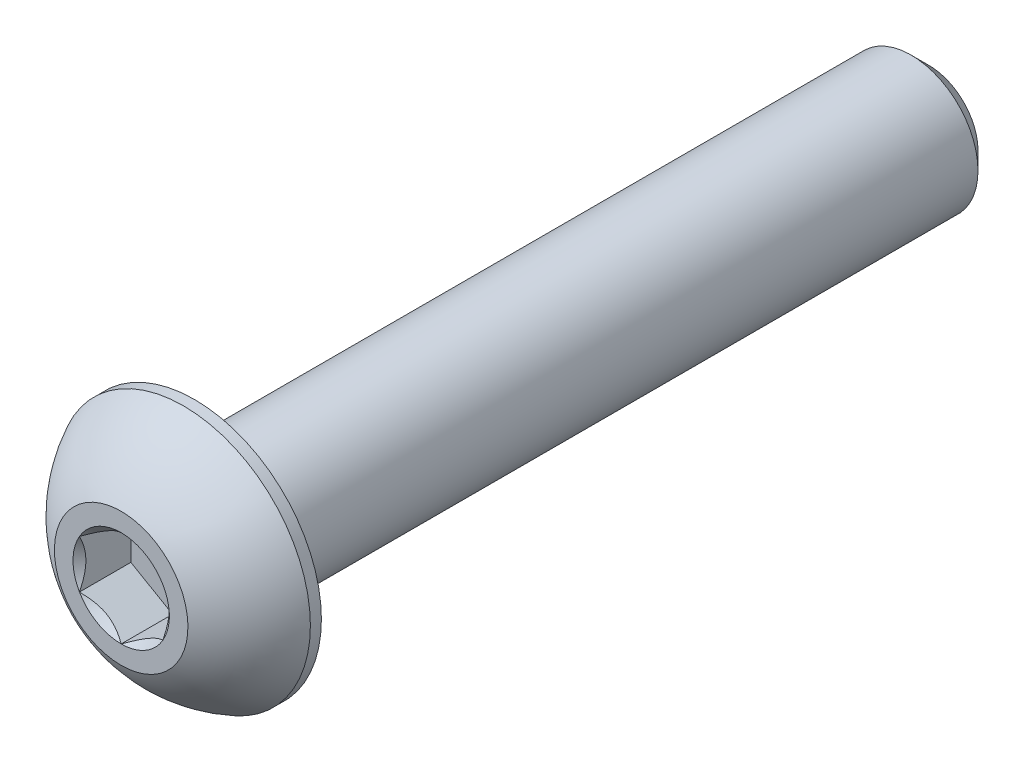
ISO-10303-21;
HEADER;
FILE_DESCRIPTION(('STEP AP214'),'2;1');
FILE_NAME('part.step','',(''),(''),'','','');
FILE_SCHEMA(('AUTOMOTIVE_DESIGN { 1 0 10303 214 1 1 1 1 }'));
ENDSEC;
DATA;
#1=APPLICATION_CONTEXT('core data for automotive mechanical design processes');
#2=APPLICATION_PROTOCOL_DEFINITION('international standard','automotive_design',2000,#1);
#3=PRODUCT_CONTEXT('',#1,'mechanical');
#4=PRODUCT('Part','Part','',(#3));
#5=PRODUCT_RELATED_PRODUCT_CATEGORY('part','',(#4));
#6=PRODUCT_DEFINITION_FORMATION('','',#4);
#7=PRODUCT_DEFINITION_CONTEXT('part definition',#1,'design');
#8=PRODUCT_DEFINITION('design','',#6,#7);
#9=PRODUCT_DEFINITION_SHAPE('','',#8);
#10=(LENGTH_UNIT() NAMED_UNIT(*) SI_UNIT(.MILLI.,.METRE.));
#11=(NAMED_UNIT(*) PLANE_ANGLE_UNIT() SI_UNIT($,.RADIAN.));
#12=(NAMED_UNIT(*) SI_UNIT($,.STERADIAN.) SOLID_ANGLE_UNIT());
#13=UNCERTAINTY_MEASURE_WITH_UNIT(LENGTH_MEASURE(1.E-05),#10,'distance_accuracy_value','');
#14=(GEOMETRIC_REPRESENTATION_CONTEXT(3) GLOBAL_UNCERTAINTY_ASSIGNED_CONTEXT((#13)) GLOBAL_UNIT_ASSIGNED_CONTEXT((#10,
#11,#12)) REPRESENTATION_CONTEXT('',''));
#15=CARTESIAN_POINT('',(0.,0.,0.));
#16=DIRECTION('',(0.,0.,1.));
#17=DIRECTION('',(1.,0.,0.));
#18=AXIS2_PLACEMENT_3D('',#15,#16,#17);
#19=CARTESIAN_POINT('',(0.,0.,-24.2));
#20=DIRECTION('',(0.,0.,1.));
#21=DIRECTION('',(1.,0.,0.));
#22=AXIS2_PLACEMENT_3D('',#19,#20,#21);
#23=PLANE('',#22);
#24=CARTESIAN_POINT('',(0.,0.,-24.2));
#25=DIRECTION('',(0.,0.,1.));
#26=DIRECTION('',(1.,0.,0.));
#27=AXIS2_PLACEMENT_3D('',#24,#25,#26);
#28=CIRCLE('',#27,1.47500000000003);
#29=CARTESIAN_POINT('',(1.47500000000003,0.,-24.2));
#30=VERTEX_POINT('',#29);
#31=EDGE_CURVE('E47',#30,#30,#28,.T.);
#32=ORIENTED_EDGE('',*,*,#31,.F.);
#33=EDGE_LOOP('',(#32));
#34=FACE_BOUND('',#33,.T.);
#35=ADVANCED_FACE('F34',(#34),#23,.F.);
#36=CARTESIAN_POINT('',(0.,0.,-24.2));
#37=DIRECTION('',(0.,0.,1.));
#38=DIRECTION('',(1.,0.,0.));
#39=AXIS2_PLACEMENT_3D('',#36,#37,#38);
#40=CONICAL_SURFACE('',#39,1.47500000000003,0.785398163397436);
#41=CARTESIAN_POINT('',(0.,0.,-23.675));
#42=DIRECTION('',(0.,0.,1.));
#43=DIRECTION('',(1.,0.,0.));
#44=AXIS2_PLACEMENT_3D('',#41,#42,#43);
#45=CIRCLE('',#44,2.00000000000001);
#46=CARTESIAN_POINT('',(2.00000000000001,0.,-23.675));
#47=VERTEX_POINT('',#46);
#48=EDGE_CURVE('E173',#47,#47,#45,.T.);
#49=ORIENTED_EDGE('',*,*,#48,.F.);
#50=EDGE_LOOP('',(#49));
#51=FACE_BOUND('',#50,.T.);
#52=ORIENTED_EDGE('',*,*,#31,.T.);
#53=EDGE_LOOP('',(#52));
#54=FACE_BOUND('',#53,.T.);
#55=ADVANCED_FACE('F178',(#51,#54),#40,.T.);
#56=CARTESIAN_POINT('',(0.,0.,0.));
#57=DIRECTION('',(0.,0.,1.));
#58=DIRECTION('',(1.,0.,0.));
#59=AXIS2_PLACEMENT_3D('',#56,#57,#58);
#60=CYLINDRICAL_SURFACE('',#59,2.00000000000001);
#61=CARTESIAN_POINT('',(0.,0.,-2.2));
#62=DIRECTION('',(0.,0.,1.));
#63=DIRECTION('',(1.,0.,0.));
#64=AXIS2_PLACEMENT_3D('',#61,#62,#63);
#65=CIRCLE('',#64,2.00000000000001);
#66=CARTESIAN_POINT('',(2.00000000000001,0.,-2.2));
#67=VERTEX_POINT('',#66);
#68=EDGE_CURVE('E170',#67,#67,#65,.T.);
#69=ORIENTED_EDGE('',*,*,#68,.F.);
#70=EDGE_LOOP('',(#69));
#71=FACE_BOUND('',#70,.T.);
#72=ORIENTED_EDGE('',*,*,#48,.T.);
#73=EDGE_LOOP('',(#72));
#74=FACE_BOUND('',#73,.T.);
#75=ADVANCED_FACE('F184',(#71,#74),#60,.T.);
#76=CARTESIAN_POINT('',(0.,-3.8,-2.2));
#77=DIRECTION('',(0.,0.,1.));
#78=DIRECTION('',(1.,0.,0.));
#79=AXIS2_PLACEMENT_3D('',#76,#77,#78);
#80=PLANE('',#79);
#81=CARTESIAN_POINT('',(0.,0.,-2.2));
#82=DIRECTION('',(0.,0.,1.));
#83=DIRECTION('',(1.,0.,0.));
#84=AXIS2_PLACEMENT_3D('',#81,#82,#83);
#85=CIRCLE('',#84,3.8);
#86=CARTESIAN_POINT('',(3.8,0.,-2.2));
#87=VERTEX_POINT('',#86);
#88=EDGE_CURVE('E164',#87,#87,#85,.T.);
#89=ORIENTED_EDGE('',*,*,#88,.F.);
#90=EDGE_LOOP('',(#89));
#91=FACE_BOUND('',#90,.T.);
#92=ORIENTED_EDGE('',*,*,#68,.T.);
#93=EDGE_LOOP('',(#92));
#94=FACE_BOUND('',#93,.T.);
#95=ADVANCED_FACE('F189',(#91,#94),#80,.F.);
#96=CARTESIAN_POINT('',(0.,0.,-3.72644385026738));
#97=DIRECTION('',(0.,0.,1.));
#98=DIRECTION('',(0.,-1.,0.));
#99=AXIS2_PLACEMENT_3D('',#96,#97,#98);
#100=SPHERICAL_SURFACE('',#99,4.22922968981299);
#101=CARTESIAN_POINT('',(0.,0.,0.));
#102=DIRECTION('',(0.,0.,1.));
#103=DIRECTION('',(1.,0.,0.));
#104=AXIS2_PLACEMENT_3D('',#101,#102,#103);
#105=CIRCLE('',#104,2.00000000000001);
#106=CARTESIAN_POINT('',(0.,-2.00000000000001,0.));
#107=VERTEX_POINT('',#106);
#108=EDGE_CURVE('E167',#107,#107,#105,.T.);
#109=CARTESIAN_POINT('',(0.,0.,-1.87));
#110=DIRECTION('',(0.,0.,1.));
#111=DIRECTION('',(1.,0.,0.));
#112=AXIS2_PLACEMENT_3D('',#109,#110,#111);
#113=CIRCLE('',#112,3.8);
#114=CARTESIAN_POINT('',(0.,-3.8,-1.87));
#115=VERTEX_POINT('',#114);
#116=EDGE_CURVE('E161',#115,#115,#113,.T.);
#117=CARTESIAN_POINT('',(0.,-2.00000000000001,0.));
#118=CARTESIAN_POINT('',(0.,-2.02421343985615,-0.0129954259644869));
#119=CARTESIAN_POINT('',(0.,-2.04830018323976,-0.0262269129651298));
#120=CARTESIAN_POINT('',(0.,-2.09621120342127,-0.0531568415057489));
#121=CARTESIAN_POINT('',(0.,-2.12003548021918,-0.0668552830457251));
#122=CARTESIAN_POINT('',(0.,-2.16741249358868,-0.0947139531320313));
#123=CARTESIAN_POINT('',(0.,-2.19096523016027,-0.108874181678362));
#124=CARTESIAN_POINT('',(0.,-2.23779021933684,-0.137651035235957));
#125=CARTESIAN_POINT('',(0.,-2.26106247194182,-0.152267660247222));
#126=CARTESIAN_POINT('',(0.,-2.30731764886073,-0.181951755514141));
#127=CARTESIAN_POINT('',(0.,-2.33030057317466,-0.197019225769796));
#128=CARTESIAN_POINT('',(0.,-2.37596836104236,-0.227599285582871));
#129=CARTESIAN_POINT('',(0.,-2.39865322459613,-0.243111875140292));
#130=CARTESIAN_POINT('',(0.,-2.44371627121514,-0.274576279395883));
#131=CARTESIAN_POINT('',(0.,-2.46609445428039,-0.290528094094054));
#132=CARTESIAN_POINT('',(0.,-2.51053563686182,-0.322864887331673));
#133=CARTESIAN_POINT('',(0.,-2.53259863637801,-0.339249865871121));
#134=CARTESIAN_POINT('',(0.,-2.57640106852493,-0.372446760967232));
#135=CARTESIAN_POINT('',(0.,-2.59814050115565,-0.389258677523893));
#136=CARTESIAN_POINT('',(0.,-2.64128753915154,-0.423303060588149));
#137=CARTESIAN_POINT('',(0.,-2.66269514451672,-0.440535527095743));
#138=CARTESIAN_POINT('',(0.,-2.70517039368396,-0.475414462202968));
#139=CARTESIAN_POINT('',(0.,-2.72623803748603,-0.493060930802598));
#140=CARTESIAN_POINT('',(0.,-2.76802535840619,-0.52876116492441));
#141=CARTESIAN_POINT('',(0.,-2.78874503552429,-0.546814930446591));
#142=CARTESIAN_POINT('',(0.,-2.82982855017314,-0.583322898482808));
#143=CARTESIAN_POINT('',(0.,-2.8501923877039,-0.601777100996845));
#144=CARTESIAN_POINT('',(0.,-2.89055648548395,-0.639078930931024));
#145=CARTESIAN_POINT('',(0.,-2.91055674573325,-0.657926558351167));
#146=CARTESIAN_POINT('',(0.,-2.95018608940553,-0.696008076521268));
#147=CARTESIAN_POINT('',(0.,-2.96981517282853,-0.715241967271226));
#148=CARTESIAN_POINT('',(0.,-3.00869470434028,-0.754088703755296));
#149=CARTESIAN_POINT('',(0.,-3.02794515242904,-0.773701549489407));
#150=CARTESIAN_POINT('',(0.,-3.06606009863533,-0.813298743603727));
#151=CARTESIAN_POINT('',(0.,-3.08492459675287,-0.833283091983936));
#152=CARTESIAN_POINT('',(0.,-3.12226047503003,-0.873615697891679));
#153=CARTESIAN_POINT('',(0.,-3.14073185518965,-0.893963955419214));
#154=CARTESIAN_POINT('',(0.,-3.17727447893822,-0.935016647847444));
#155=CARTESIAN_POINT('',(0.,-3.19534572252716,-0.95572108274814));
#156=CARTESIAN_POINT('',(0.,-3.23108120656243,-0.99747826281099));
#157=CARTESIAN_POINT('',(0.,-3.24874544700875,-1.01853100797314));
#158=CARTESIAN_POINT('',(0.,-3.28366021283673,-1.06097680909897));
#159=CARTESIAN_POINT('',(0.,-3.30091073821839,-1.08236986506264));
#160=CARTESIAN_POINT('',(0.,-3.33499151919534,-1.12548815902284));
#161=CARTESIAN_POINT('',(0.,-3.35182177479064,-1.14721339701936));
#162=CARTESIAN_POINT('',(0.,-3.38505562116372,-1.1909878000568));
#163=CARTESIAN_POINT('',(0.,-3.40145921194149,-1.21303696509771));
#164=CARTESIAN_POINT('',(0.,-3.43383349577047,-1.25745084415152));
#165=CARTESIAN_POINT('',(0.,-3.44980418882167,-1.27981555816441));
#166=CARTESIAN_POINT('',(0.,-3.48130660877275,-1.32485203719233));
#167=CARTESIAN_POINT('',(0.,-3.49683833567264,-1.34752380220736));
#168=CARTESIAN_POINT('',(0.,-3.52745692170932,-1.39316576858967));
#169=CARTESIAN_POINT('',(0.,-3.5425437808461,-1.41613596995695));
#170=CARTESIAN_POINT('',(0.,-3.57226689871518,-1.46236608103065));
#171=CARTESIAN_POINT('',(0.,-3.58690315744748,-1.48562599073709));
#172=CARTESIAN_POINT('',(0.,-3.615719513332,-1.5324266802666));
#173=CARTESIAN_POINT('',(0.,-3.62989961048422,-1.55596746008967));
#174=CARTESIAN_POINT('',(0.,-3.65779825442823,-1.6033209453859));
#175=CARTESIAN_POINT('',(0.,-3.67151680122002,-1.62713365085906));
#176=CARTESIAN_POINT('',(0.,-3.69848713452322,-1.67502193787766));
#177=CARTESIAN_POINT('',(0.,-3.71173892103461,-1.6990975194231));
#178=CARTESIAN_POINT('',(0.,-3.73777068821038,-1.74750241579215));
#179=CARTESIAN_POINT('',(0.,-3.75055066887474,-1.77183173061575));
#180=CARTESIAN_POINT('',(0.,-3.77563400658953,-1.82073482944519));
#181=CARTESIAN_POINT('',(0.,-3.78793736363997,-1.84530861345103));
#182=CARTESIAN_POINT('',(0.,-3.8,-1.87));
#183=B_SPLINE_CURVE_WITH_KNOTS('',3,(#117,#118,#119,#120,#121,#122,#123,#124,#125,#126,#127,
#128,#129,#130,#131,#132,#133,#134,#135,#136,#137,#138,#139,#140,#141,#142,#143,#144,#145,#146,
#147,#148,#149,#150,#151,#152,#153,#154,#155,#156,#157,#158,#159,#160,#161,#162,#163,#164,#165,
#166,#167,#168,#169,#170,#171,#172,#173,#174,#175,#176,#177,#178,#179,#180,#181,#182),
.UNSPECIFIED.,.F.,.F.,(4,2,2,2,2,2,2,2,2,2,2,2,2,2,2,2,2,2,2,2,2,2,2,2,2,2,2,2,2,2,2,2,4),(0.,
0.0824398589102638,0.164879717820528,0.247319576730792,0.329759435641056,0.41219929455132,
0.494639153461583,0.577079012371847,0.659518871282112,0.741958730192376,0.82439858910264,
0.906838448012904,0.989278306923168,1.07171816583343,1.1541580247437,1.23659788365396,
1.31903774256422,1.40147760147449,1.48391746038475,1.56635731929502,1.64879717820528,
1.73123703711554,1.81367689602581,1.89611675493607,1.97855661384634,2.0609964727566,
2.14343633166686,2.22587619057713,2.30831604948739,2.39075590839766,2.47319576730792,
2.55563562621818,2.63807548512845),.UNSPECIFIED.);
#184=EDGE_CURVE('BSEAM194',#107,#115,#183,.T.);
#185=ORIENTED_EDGE('',*,*,#108,.F.);
#186=ORIENTED_EDGE('',*,*,#116,.T.);
#187=ORIENTED_EDGE('',*,*,#184,.T.);
#188=ORIENTED_EDGE('',*,*,#184,.F.);
#189=EDGE_LOOP('',(#185,#187,#186,#188));
#190=FACE_BOUND('',#189,.T.);
#191=ADVANCED_FACE('F194',(#190),#100,.T.);
#192=CARTESIAN_POINT('',(0.,-2.00000000000001,0.));
#193=DIRECTION('',(0.,0.,-1.));
#194=DIRECTION('',(-1.,0.,0.));
#195=AXIS2_PLACEMENT_3D('',#192,#193,#194);
#196=PLANE('',#195);
#197=CARTESIAN_POINT('',(0.,0.,0.));
#198=DIRECTION('',(0.,0.,1.));
#199=DIRECTION('',(1.,0.,0.));
#200=AXIS2_PLACEMENT_3D('',#197,#198,#199);
#201=CIRCLE('',#200,1.44337567297406);
#202=CARTESIAN_POINT('',(-1.25,0.721687836487031,0.));
#203=VERTEX_POINT('',#202);
#204=CARTESIAN_POINT('',(-1.25,-0.721687836487033,0.));
#205=VERTEX_POINT('',#204);
#206=EDGE_CURVE('E60',#203,#205,#201,.T.);
#207=ORIENTED_EDGE('',*,*,#206,.F.);
#208=CARTESIAN_POINT('',(0.,1.44337567297406,0.));
#209=VERTEX_POINT('',#208);
#210=EDGE_CURVE('E132',#209,#203,#201,.T.);
#211=ORIENTED_EDGE('',*,*,#210,.F.);
#212=CARTESIAN_POINT('',(1.25,0.721687836487029,0.));
#213=VERTEX_POINT('',#212);
#214=EDGE_CURVE('E129',#213,#209,#201,.T.);
#215=ORIENTED_EDGE('',*,*,#214,.F.);
#216=CARTESIAN_POINT('',(1.25,-0.721687836487029,0.));
#217=VERTEX_POINT('',#216);
#218=EDGE_CURVE('E100',#217,#213,#201,.T.);
#219=ORIENTED_EDGE('',*,*,#218,.F.);
#220=CARTESIAN_POINT('',(0.,-1.44337567297406,0.));
#221=VERTEX_POINT('',#220);
#222=EDGE_CURVE('E92',#221,#217,#201,.T.);
#223=ORIENTED_EDGE('',*,*,#222,.F.);
#224=EDGE_CURVE('E53',#205,#221,#201,.T.);
#225=ORIENTED_EDGE('',*,*,#224,.F.);
#226=EDGE_LOOP('',(#207,#211,#215,#219,#223,#225));
#227=FACE_BOUND('',#226,.T.);
#228=ORIENTED_EDGE('',*,*,#108,.T.);
#229=EDGE_LOOP('',(#228));
#230=FACE_BOUND('',#229,.T.);
#231=ADVANCED_FACE('F126',(#227,#230),#196,.F.);
#232=CARTESIAN_POINT('',(0.,0.,0.));
#233=DIRECTION('',(0.,0.,1.));
#234=DIRECTION('',(1.,0.,0.));
#235=AXIS2_PLACEMENT_3D('',#232,#233,#234);
#236=CYLINDRICAL_SURFACE('',#235,3.8);
#237=ORIENTED_EDGE('',*,*,#116,.F.);
#238=EDGE_LOOP('',(#237));
#239=FACE_BOUND('',#238,.T.);
#240=ORIENTED_EDGE('',*,*,#88,.T.);
#241=EDGE_LOOP('',(#240));
#242=FACE_BOUND('',#241,.T.);
#243=ADVANCED_FACE('F200',(#239,#242),#236,.T.);
#244=CARTESIAN_POINT('',(0.,0.,0.));
#245=DIRECTION('',(0.,0.,1.));
#246=DIRECTION('',(1.,0.,0.));
#247=AXIS2_PLACEMENT_3D('',#244,#245,#246);
#248=CONICAL_SURFACE('',#247,1.44337567297406,0.78539816339745);
#249=ORIENTED_EDGE('',*,*,#218,.T.);
#250=CARTESIAN_POINT('',(1.25,-1.43934010808076,0.462982096892323));
#251=CARTESIAN_POINT('',(1.25,-1.40429313005658,0.436524922632886));
#252=CARTESIAN_POINT('',(1.25,-1.36905087135598,0.410327160354276));
#253=CARTESIAN_POINT('',(1.25,-1.2980965070631,0.358557571839581));
#254=CARTESIAN_POINT('',(1.25,-1.26238428576495,0.332985904356291));
#255=CARTESIAN_POINT('',(1.25,-1.15390111792707,0.257005993689462));
#256=CARTESIAN_POINT('',(1.25,-1.08031646726264,0.207740286189565));
#257=CARTESIAN_POINT('',(1.25,-0.926012322755091,0.111025830263131));
#258=CARTESIAN_POINT('',(1.25,-0.845125318656143,0.0638412989417957));
#259=CARTESIAN_POINT('',(1.25,-0.679311174076599,-0.0224692656095865));
#260=CARTESIAN_POINT('',(1.25,-0.594398891026685,-0.0616224653730992));
#261=CARTESIAN_POINT('',(1.25,-0.466944812460738,-0.109522776311707));
#262=CARTESIAN_POINT('',(1.25,-0.426289985812819,-0.123270510213663));
#263=CARTESIAN_POINT('',(1.25,-0.343998850091265,-0.147502072549456));
#264=CARTESIAN_POINT('',(1.25,-0.30236247361496,-0.157985676130227));
#265=CARTESIAN_POINT('',(1.25,-0.219052696285663,-0.174969838251702));
#266=CARTESIAN_POINT('',(1.25,-0.177393428474498,-0.18153863952863));
#267=CARTESIAN_POINT('',(1.25,-0.0936293693401902,-0.190564946542239));
#268=CARTESIAN_POINT('',(1.25,-0.0515246558543941,-0.193023159002731));
#269=CARTESIAN_POINT('',(1.25,0.0311890576306333,-0.193645937986714));
#270=CARTESIAN_POINT('',(1.25,0.071796962549932,-0.191962883153752));
#271=CARTESIAN_POINT('',(1.25,0.152668636885198,-0.184731729402085));
#272=CARTESIAN_POINT('',(1.25,0.192932338835359,-0.179182889586891));
#273=CARTESIAN_POINT('',(1.25,0.273499879165296,-0.164428963535045));
#274=CARTESIAN_POINT('',(1.25,0.313792180618512,-0.155161824035893));
#275=CARTESIAN_POINT('',(1.25,0.393496413911458,-0.133463821542651));
#276=CARTESIAN_POINT('',(1.25,0.43290841911506,-0.121033223269353));
#277=CARTESIAN_POINT('',(1.25,0.556992735862299,-0.0772206470685609));
#278=CARTESIAN_POINT('',(1.25,0.639898924666086,-0.0408489271240422));
#279=CARTESIAN_POINT('',(1.25,0.801816555499702,0.0400191621783368));
#280=CARTESIAN_POINT('',(1.25,0.880812666325045,0.084544720911988));
#281=CARTESIAN_POINT('',(1.25,1.0317856127975,0.176404876666627));
#282=CARTESIAN_POINT('',(1.25,1.10391618485086,0.223489933916251));
#283=CARTESIAN_POINT('',(1.25,1.21018606043311,0.29627856159854));
#284=CARTESIAN_POINT('',(1.25,1.24515069969379,0.32079808539336));
#285=CARTESIAN_POINT('',(1.25,1.31460220852737,0.370485636765682));
#286=CARTESIAN_POINT('',(1.25,1.34908920596618,0.395653485415522));
#287=CARTESIAN_POINT('',(1.25,1.38337731682912,0.421090148841215));
#288=B_SPLINE_CURVE_WITH_KNOTS('',3,(#250,#251,#252,#253,#254,#255,#256,#257,#258,#259,#260,
#261,#262,#263,#264,#265,#266,#267,#268,#269,#270,#271,#272,#273,#274,#275,#276,#277,#278,#279,
#280,#281,#282,#283,#284,#285,#286,#287),.UNSPECIFIED.,.F.,.F.,(4,2,2,2,2,2,2,2,2,2,2,2,2,2,2,2,
2,2,4),(0.,0.131732960381447,0.263498984161643,0.529042014455823,0.809741926134614,
1.08947609717225,1.21811634272576,1.346765447839,1.47310084517843,1.59941451973784,
1.72115042167849,1.84290966131734,1.96679153905341,2.09066305366038,2.36146692896008,
2.6332598919849,2.89154668212278,3.01965734507712,3.14773302245627),.UNSPECIFIED.);
#289=EDGE_CURVE('E11',#217,#213,#288,.T.);
#290=ORIENTED_EDGE('',*,*,#289,.F.);
#291=EDGE_LOOP('',(#249,#290));
#292=FACE_BOUND('',#291,.T.);
#293=ADVANCED_FACE('F104',(#292),#248,.F.);
#294=ORIENTED_EDGE('',*,*,#214,.T.);
#295=CARTESIAN_POINT('',(1.2502,0.721572366433193,0.000115483909137106));
#296=CARTESIAN_POINT('',(1.20722483292841,0.746384090710443,-0.0246783319448953));
#297=CARTESIAN_POINT('',(1.16353099525405,0.771610739653663,-0.0480162655813155));
#298=CARTESIAN_POINT('',(1.07443406915806,0.823050873919154,-0.0907479959154626));
#299=CARTESIAN_POINT('',(1.02902250164294,0.849269254648332,-0.110118007639585));
#300=CARTESIAN_POINT('',(0.93745217906474,0.902137405038635,-0.143299516586522));
#301=CARTESIAN_POINT('',(0.891316759824114,0.928773701756386,-0.157194440947344));
#302=CARTESIAN_POINT('',(0.798029919592407,0.982632884076012,-0.178602717839361));
#303=CARTESIAN_POINT('',(0.75088135086362,1.00985412292348,-0.186132058433213));
#304=CARTESIAN_POINT('',(0.669626443112747,1.05676666578643,-0.192925501949297));
#305=CARTESIAN_POINT('',(0.635625123372058,1.07639733689152,-0.19393144089565));
#306=CARTESIAN_POINT('',(0.567682235567522,1.11562418145499,-0.192238585088681));
#307=CARTESIAN_POINT('',(0.533740682344342,1.1352203463451,-0.189538972784461));
#308=CARTESIAN_POINT('',(0.4661851435425,1.1742235548576,-0.180591069683622));
#309=CARTESIAN_POINT('',(0.432571492713225,1.19363040521232,-0.174339474100294));
#310=CARTESIAN_POINT('',(0.365905361782186,1.23212011385119,-0.158624318586096));
#311=CARTESIAN_POINT('',(0.332853128969704,1.2512028293628,-0.149159379912542));
#312=CARTESIAN_POINT('',(0.248200308399735,1.30007715810653,-0.121068609312414));
#313=CARTESIAN_POINT('',(0.197133507570362,1.32956058931202,-0.100329842547799));
#314=CARTESIAN_POINT('',(0.0969991458867455,1.38737318998519,-0.0536128653285237));
#315=CARTESIAN_POINT('',(0.0479256884217311,1.41570576386268,-0.0276517040532341));
#316=CARTESIAN_POINT('',(-0.000199999999999383,1.4434911430279,0.000115483909135572));
#317=B_SPLINE_CURVE_WITH_KNOTS('',3,(#295,#296,#297,#298,#299,#300,#301,#302,#303,#304,#305,
#306,#307,#308,#309,#310,#311,#312,#313,#314,#315,#316),.UNSPECIFIED.,.F.,.F.,(4,2,2,2,2,2,2,2,
2,2,4),(0.,0.166533409618304,0.334037607289762,0.498880396489699,0.663307919240276,
0.780963963458828,0.898645970148454,1.01643764860773,1.1342799317155,1.32148652032141,
1.50809158792573),.UNSPECIFIED.);
#318=EDGE_CURVE('E131',#213,#209,#317,.T.);
#319=ORIENTED_EDGE('',*,*,#318,.F.);
#320=EDGE_LOOP('',(#294,#319));
#321=FACE_BOUND('',#320,.T.);
#322=ADVANCED_FACE('F287',(#321),#248,.F.);
#323=ORIENTED_EDGE('',*,*,#210,.T.);
#324=CARTESIAN_POINT('',(0.000200000000000433,1.4434911430279,0.000115483909135892));
#325=CARTESIAN_POINT('',(-0.0427751670715862,1.41867941875065,-0.0246783319448965));
#326=CARTESIAN_POINT('',(-0.0864690047459474,1.39345276980743,-0.0480162655813166));
#327=CARTESIAN_POINT('',(-0.175565930841941,1.34201263554194,-0.0907479959154634));
#328=CARTESIAN_POINT('',(-0.220977498357063,1.31579425481276,-0.110118007639586));
#329=CARTESIAN_POINT('',(-0.312547820935259,1.26292610442246,-0.143299516586523));
#330=CARTESIAN_POINT('',(-0.358683240175885,1.23628980770471,-0.157194440947344));
#331=CARTESIAN_POINT('',(-0.451970080407591,1.18243062538508,-0.178602717839361));
#332=CARTESIAN_POINT('',(-0.499118649136379,1.15520938653761,-0.186132058433213));
#333=CARTESIAN_POINT('',(-0.580373556887251,1.10829684367467,-0.192925501949298));
#334=CARTESIAN_POINT('',(-0.61437487662794,1.08866617256958,-0.193931440895651));
#335=CARTESIAN_POINT('',(-0.682317764432476,1.04943932800611,-0.192238585088682));
#336=CARTESIAN_POINT('',(-0.716259317655656,1.02984316311599,-0.189538972784462));
#337=CARTESIAN_POINT('',(-0.783814856457498,0.990839954603498,-0.180591069683623));
#338=CARTESIAN_POINT('',(-0.817428507286774,0.97143310424877,-0.174339474100295));
#339=CARTESIAN_POINT('',(-0.884094638217812,0.932943395609904,-0.158624318586097));
#340=CARTESIAN_POINT('',(-0.917146871030294,0.913860680098299,-0.149159379912542));
#341=CARTESIAN_POINT('',(-1.00179969160026,0.864986351354567,-0.121068609312415));
#342=CARTESIAN_POINT('',(-1.05286649242964,0.835502920149075,-0.1003298425478));
#343=CARTESIAN_POINT('',(-1.15300085411325,0.777690319475907,-0.0536128653285245));
#344=CARTESIAN_POINT('',(-1.20207431157827,0.749357745598416,-0.0276517040532348));
#345=CARTESIAN_POINT('',(-1.2502,0.721572366433194,0.000115483909135054));
#346=B_SPLINE_CURVE_WITH_KNOTS('',3,(#324,#325,#326,#327,#328,#329,#330,#331,#332,#333,#334,
#335,#336,#337,#338,#339,#340,#341,#342,#343,#344,#345),.UNSPECIFIED.,.F.,.F.,(4,2,2,2,2,2,2,2,
2,2,4),(0.,0.166533409618303,0.334037607289761,0.498880396489697,0.663307919240274,
0.780963963458826,0.898645970148452,1.01643764860773,1.13427993171549,1.32148652032141,
1.50809158792573),.UNSPECIFIED.);
#347=EDGE_CURVE('E136',#209,#203,#346,.T.);
#348=ORIENTED_EDGE('',*,*,#347,.F.);
#349=EDGE_LOOP('',(#323,#348));
#350=FACE_BOUND('',#349,.T.);
#351=ADVANCED_FACE('F139',(#350),#248,.F.);
#352=ORIENTED_EDGE('',*,*,#206,.T.);
#353=CARTESIAN_POINT('',(-1.25,-1.43934010808077,0.462982096892325));
#354=CARTESIAN_POINT('',(-1.25,-1.40429313005658,0.436524922632887));
#355=CARTESIAN_POINT('',(-1.25,-1.36905087135599,0.410327160354277));
#356=CARTESIAN_POINT('',(-1.25,-1.29809650706311,0.358557571839583));
#357=CARTESIAN_POINT('',(-1.25,-1.26238428576495,0.332985904356292));
#358=CARTESIAN_POINT('',(-1.25,-1.15390111792708,0.257005993689462));
#359=CARTESIAN_POINT('',(-1.25,-1.08031646726264,0.207740286189565));
#360=CARTESIAN_POINT('',(-1.25,-0.926012322755094,0.11102583026313));
#361=CARTESIAN_POINT('',(-1.25,-0.845125318656146,0.0638412989417953));
#362=CARTESIAN_POINT('',(-1.25,-0.679311174076601,-0.0224692656095875));
#363=CARTESIAN_POINT('',(-1.25,-0.594398891026687,-0.0616224653731005));
#364=CARTESIAN_POINT('',(-1.25,-0.46694481246074,-0.109522776311709));
#365=CARTESIAN_POINT('',(-1.25,-0.426289985812821,-0.123270510213665));
#366=CARTESIAN_POINT('',(-1.25,-0.343998850091267,-0.147502072549458));
#367=CARTESIAN_POINT('',(-1.25,-0.302362473614962,-0.157985676130229));
#368=CARTESIAN_POINT('',(-1.25,-0.219052696285665,-0.174969838251704));
#369=CARTESIAN_POINT('',(-1.25,-0.1773934284745,-0.181538639528632));
#370=CARTESIAN_POINT('',(-1.25,-0.0936293693401922,-0.190564946542242));
#371=CARTESIAN_POINT('',(-1.25,-0.051524655854396,-0.193023159002733));
#372=CARTESIAN_POINT('',(-1.25,0.0311890576306315,-0.193645937986716));
#373=CARTESIAN_POINT('',(-1.25,0.0717969625499304,-0.191962883153754));
#374=CARTESIAN_POINT('',(-1.25,0.152668636885197,-0.184731729402088));
#375=CARTESIAN_POINT('',(-1.25,0.192932338835358,-0.179182889586893));
#376=CARTESIAN_POINT('',(-1.25,0.273499879165295,-0.164428963535048));
#377=CARTESIAN_POINT('',(-1.25,0.313792180618511,-0.155161824035896));
#378=CARTESIAN_POINT('',(-1.25,0.393496413911457,-0.133463821542654));
#379=CARTESIAN_POINT('',(-1.25,0.432908419115058,-0.121033223269356));
#380=CARTESIAN_POINT('',(-1.25,0.556992735862297,-0.0772206470685636));
#381=CARTESIAN_POINT('',(-1.25,0.639898924666085,-0.0408489271240449));
#382=CARTESIAN_POINT('',(-1.25,0.8018165554997,0.040019162178334));
#383=CARTESIAN_POINT('',(-1.25,0.880812666325043,0.084544720911985));
#384=CARTESIAN_POINT('',(-1.25,1.0317856127975,0.176404876666624));
#385=CARTESIAN_POINT('',(-1.25,1.10391618485086,0.223489933916248));
#386=CARTESIAN_POINT('',(-1.25,1.2101860604331,0.296278561598537));
#387=CARTESIAN_POINT('',(-1.25,1.24515069969379,0.320798085393357));
#388=CARTESIAN_POINT('',(-1.25,1.31460220852736,0.370485636765679));
#389=CARTESIAN_POINT('',(-1.25,1.34908920596618,0.395653485415518));
#390=CARTESIAN_POINT('',(-1.25,1.38337731682911,0.421090148841212));
#391=B_SPLINE_CURVE_WITH_KNOTS('',3,(#353,#354,#355,#356,#357,#358,#359,#360,#361,#362,#363,
#364,#365,#366,#367,#368,#369,#370,#371,#372,#373,#374,#375,#376,#377,#378,#379,#380,#381,#382,
#383,#384,#385,#386,#387,#388,#389,#390),.UNSPECIFIED.,.F.,.F.,(4,2,2,2,2,2,2,2,2,2,2,2,2,2,2,2,
2,2,4),(0.,0.131732960381448,0.263498984161644,0.529042014455824,0.809741926134617,
1.08947609717225,1.21811634272576,1.346765447839,1.47310084517844,1.59941451973784,
1.72115042167849,1.84290966131735,1.96679153905341,2.09066305366039,2.36146692896009,
2.63325989198491,2.89154668212279,3.01965734507712,3.14773302245628),.UNSPECIFIED.);
#392=EDGE_CURVE('E143',#203,#205,#391,.F.);
#393=ORIENTED_EDGE('',*,*,#392,.F.);
#394=EDGE_LOOP('',(#352,#393));
#395=FACE_BOUND('',#394,.T.);
#396=ADVANCED_FACE('F281',(#395),#248,.F.);
#397=ORIENTED_EDGE('',*,*,#224,.T.);
#398=CARTESIAN_POINT('',(-1.2502,-0.721572366433194,0.000115483909134937));
#399=CARTESIAN_POINT('',(-1.20722483292841,-0.746384090710444,-0.0246783319448973));
#400=CARTESIAN_POINT('',(-1.16353099525405,-0.771610739653664,-0.0480162655813174));
#401=CARTESIAN_POINT('',(-1.07443406915806,-0.823050873919154,-0.0907479959154642));
#402=CARTESIAN_POINT('',(-1.02902250164293,-0.849269254648332,-0.110118007639587));
#403=CARTESIAN_POINT('',(-0.937452179064738,-0.902137405038635,-0.143299516586524));
#404=CARTESIAN_POINT('',(-0.891316759824113,-0.928773701756386,-0.157194440947345));
#405=CARTESIAN_POINT('',(-0.798029919592406,-0.982632884076012,-0.178602717839362));
#406=CARTESIAN_POINT('',(-0.750881350863619,-1.00985412292348,-0.186132058433214));
#407=CARTESIAN_POINT('',(-0.669626443112746,-1.05676666578643,-0.192925501949298));
#408=CARTESIAN_POINT('',(-0.635625123372058,-1.07639733689152,-0.193931440895651));
#409=CARTESIAN_POINT('',(-0.567682235567521,-1.11562418145499,-0.192238585088682));
#410=CARTESIAN_POINT('',(-0.533740682344341,-1.1352203463451,-0.189538972784462));
#411=CARTESIAN_POINT('',(-0.466185143542499,-1.1742235548576,-0.180591069683623));
#412=CARTESIAN_POINT('',(-0.432571492713224,-1.19363040521232,-0.174339474100295));
#413=CARTESIAN_POINT('',(-0.365905361782186,-1.23212011385119,-0.158624318586096));
#414=CARTESIAN_POINT('',(-0.332853128969703,-1.25120282936279,-0.149159379912542));
#415=CARTESIAN_POINT('',(-0.248200308399735,-1.30007715810653,-0.121068609312415));
#416=CARTESIAN_POINT('',(-0.197133507570361,-1.32956058931202,-0.1003298425478));
#417=CARTESIAN_POINT('',(-0.0969991458867451,-1.38737318998519,-0.0536128653285245));
#418=CARTESIAN_POINT('',(-0.0479256884217308,-1.41570576386268,-0.0276517040532348));
#419=CARTESIAN_POINT('',(0.000199999999999627,-1.4434911430279,0.000115483909135029));
#420=B_SPLINE_CURVE_WITH_KNOTS('',3,(#398,#399,#400,#401,#402,#403,#404,#405,#406,#407,#408,
#409,#410,#411,#412,#413,#414,#415,#416,#417,#418,#419),.UNSPECIFIED.,.F.,.F.,(4,2,2,2,2,2,2,2,
2,2,4),(0.,0.166533409618303,0.334037607289761,0.498880396489697,0.663307919240273,
0.780963963458825,0.898645970148451,1.01643764860773,1.13427993171549,1.32148652032141,
1.50809158792573),.UNSPECIFIED.);
#421=EDGE_CURVE('E116',#205,#221,#420,.T.);
#422=ORIENTED_EDGE('',*,*,#421,.F.);
#423=EDGE_LOOP('',(#397,#422));
#424=FACE_BOUND('',#423,.T.);
#425=ADVANCED_FACE('F229',(#424),#248,.F.);
#426=ORIENTED_EDGE('',*,*,#222,.T.);
#427=CARTESIAN_POINT('',(-0.000200000000000326,-1.4434911430279,0.000115483909135025));
#428=CARTESIAN_POINT('',(0.0427751670715863,-1.41867941875065,-0.0246783319448973));
#429=CARTESIAN_POINT('',(0.0864690047459475,-1.39345276980743,-0.0480162655813174));
#430=CARTESIAN_POINT('',(0.175565930841941,-1.34201263554194,-0.0907479959154642));
#431=CARTESIAN_POINT('',(0.220977498357063,-1.31579425481276,-0.110118007639587));
#432=CARTESIAN_POINT('',(0.312547820935259,-1.26292610442246,-0.143299516586524));
#433=CARTESIAN_POINT('',(0.358683240175885,-1.23628980770471,-0.157194440947345));
#434=CARTESIAN_POINT('',(0.451970080407591,-1.18243062538508,-0.178602717839362));
#435=CARTESIAN_POINT('',(0.499118649136378,-1.15520938653761,-0.186132058433214));
#436=CARTESIAN_POINT('',(0.580373556887251,-1.10829684367467,-0.192925501949298));
#437=CARTESIAN_POINT('',(0.614374876627939,-1.08866617256958,-0.193931440895651));
#438=CARTESIAN_POINT('',(0.682317764432476,-1.04943932800611,-0.192238585088682));
#439=CARTESIAN_POINT('',(0.716259317655656,-1.02984316311599,-0.189538972784463));
#440=CARTESIAN_POINT('',(0.783814856457498,-0.990839954603497,-0.180591069683624));
#441=CARTESIAN_POINT('',(0.817428507286773,-0.971433104248769,-0.174339474100296));
#442=CARTESIAN_POINT('',(0.884094638217811,-0.932943395609904,-0.158624318586097));
#443=CARTESIAN_POINT('',(0.917146871030293,-0.913860680098299,-0.149159379912543));
#444=CARTESIAN_POINT('',(1.00179969160026,-0.864986351354566,-0.121068609312415));
#445=CARTESIAN_POINT('',(1.05286649242964,-0.835502920149074,-0.100329842547801));
#446=CARTESIAN_POINT('',(1.15300085411325,-0.777690319475906,-0.0536128653285243));
#447=CARTESIAN_POINT('',(1.20207431157827,-0.749357745598414,-0.0276517040532342));
#448=CARTESIAN_POINT('',(1.2502,-0.721572366433191,0.00011548390913593));
#449=B_SPLINE_CURVE_WITH_KNOTS('',3,(#427,#428,#429,#430,#431,#432,#433,#434,#435,#436,#437,
#438,#439,#440,#441,#442,#443,#444,#445,#446,#447,#448),.UNSPECIFIED.,.F.,.F.,(4,2,2,2,2,2,2,2,
2,2,4),(0.,0.166533409618303,0.334037607289761,0.498880396489697,0.663307919240273,
0.780963963458825,0.898645970148451,1.01643764860773,1.13427993171549,1.32148652032141,
1.50809158792574),.UNSPECIFIED.);
#450=EDGE_CURVE('E96',#221,#217,#449,.T.);
#451=ORIENTED_EDGE('',*,*,#450,.F.);
#452=EDGE_LOOP('',(#426,#451));
#453=FACE_BOUND('',#452,.T.);
#454=ADVANCED_FACE('F94',(#453),#248,.F.);
#455=CARTESIAN_POINT('',(1.25,-0.721687836487029,-1.54));
#456=DIRECTION('',(0.,0.,1.));
#457=DIRECTION('',(1.,0.,0.));
#458=AXIS2_PLACEMENT_3D('',#455,#456,#457);
#459=PLANE('',#458);
#460=DIRECTION('',(0.866025403784438,0.5,0.));
#461=VECTOR('',#460,1.);
#462=CARTESIAN_POINT('',(0.,-1.44337567297406,-1.54));
#463=LINE('',#462,#461);
#464=CARTESIAN_POINT('',(0.,-1.44337567297406,-1.54));
#465=VERTEX_POINT('',#464);
#466=CARTESIAN_POINT('',(1.25,-0.721687836487029,-1.54));
#467=VERTEX_POINT('',#466);
#468=EDGE_CURVE('E115',#465,#467,#463,.T.);
#469=ORIENTED_EDGE('',*,*,#468,.T.);
#470=DIRECTION('',(0.,1.,0.));
#471=VECTOR('',#470,1.);
#472=CARTESIAN_POINT('',(1.25,-0.721687836487029,-1.54));
#473=LINE('',#472,#471);
#474=CARTESIAN_POINT('',(1.25,0.721687836487031,-1.54));
#475=VERTEX_POINT('',#474);
#476=EDGE_CURVE('E120',#467,#475,#473,.T.);
#477=ORIENTED_EDGE('',*,*,#476,.T.);
#478=DIRECTION('',(-0.866025403784439,0.5,0.));
#479=VECTOR('',#478,1.);
#480=CARTESIAN_POINT('',(1.25,0.721687836487031,-1.54));
#481=LINE('',#480,#479);
#482=CARTESIAN_POINT('',(0.,1.44337567297406,-1.54));
#483=VERTEX_POINT('',#482);
#484=EDGE_CURVE('E271',#475,#483,#481,.T.);
#485=ORIENTED_EDGE('',*,*,#484,.T.);
#486=DIRECTION('',(-0.866025403784439,-0.5,0.));
#487=VECTOR('',#486,1.);
#488=CARTESIAN_POINT('',(0.,1.44337567297406,-1.54));
#489=LINE('',#488,#487);
#490=CARTESIAN_POINT('',(-1.25,0.721687836487031,-1.54));
#491=VERTEX_POINT('',#490);
#492=EDGE_CURVE('E152',#483,#491,#489,.T.);
#493=ORIENTED_EDGE('',*,*,#492,.T.);
#494=DIRECTION('',(0.,-1.,0.));
#495=VECTOR('',#494,1.);
#496=CARTESIAN_POINT('',(-1.25,0.721687836487031,-1.54));
#497=LINE('',#496,#495);
#498=CARTESIAN_POINT('',(-1.25,-0.721687836487032,-1.54));
#499=VERTEX_POINT('',#498);
#500=EDGE_CURVE('E275',#491,#499,#497,.T.);
#501=ORIENTED_EDGE('',*,*,#500,.T.);
#502=DIRECTION('',(0.866025403784439,-0.5,0.));
#503=VECTOR('',#502,1.);
#504=CARTESIAN_POINT('',(-1.25,-0.721687836487032,-1.54));
#505=LINE('',#504,#503);
#506=EDGE_CURVE('E123',#499,#465,#505,.T.);
#507=ORIENTED_EDGE('',*,*,#506,.T.);
#508=EDGE_LOOP('',(#469,#477,#485,#493,#501,#507));
#509=FACE_BOUND('',#508,.T.);
#510=ADVANCED_FACE('F228',(#509),#459,.T.);
#511=CARTESIAN_POINT('',(1.25,-0.721687836487029,-1.54));
#512=DIRECTION('',(1.,0.,0.));
#513=DIRECTION('',(0.,0.,-1.));
#514=AXIS2_PLACEMENT_3D('',#511,#512,#513);
#515=PLANE('',#514);
#516=DIRECTION('',(0.,0.,1.));
#517=VECTOR('',#516,1.);
#518=CARTESIAN_POINT('',(1.25,-0.721687836487029,-1.54));
#519=LINE('',#518,#517);
#520=EDGE_CURVE('E112',#467,#217,#519,.T.);
#521=ORIENTED_EDGE('',*,*,#520,.T.);
#522=ORIENTED_EDGE('',*,*,#289,.T.);
#523=DIRECTION('',(0.,0.,1.));
#524=VECTOR('',#523,1.);
#525=CARTESIAN_POINT('',(1.25,0.721687836487031,-1.54));
#526=LINE('',#525,#524);
#527=EDGE_CURVE('E122',#475,#213,#526,.T.);
#528=ORIENTED_EDGE('',*,*,#527,.F.);
#529=ORIENTED_EDGE('',*,*,#476,.F.);
#530=EDGE_LOOP('',(#521,#522,#528,#529));
#531=FACE_BOUND('',#530,.T.);
#532=ADVANCED_FACE('F118',(#531),#515,.F.);
#533=CARTESIAN_POINT('',(1.25,0.721687836487031,-1.54));
#534=DIRECTION('',(0.5,0.866025403784439,0.));
#535=DIRECTION('',(-0.866025403784439,0.5,0.));
#536=AXIS2_PLACEMENT_3D('',#533,#534,#535);
#537=PLANE('',#536);
#538=ORIENTED_EDGE('',*,*,#527,.T.);
#539=ORIENTED_EDGE('',*,*,#318,.T.);
#540=DIRECTION('',(0.,0.,1.));
#541=VECTOR('',#540,1.);
#542=CARTESIAN_POINT('',(0.,1.44337567297406,-1.54));
#543=LINE('',#542,#541);
#544=EDGE_CURVE('E148',#483,#209,#543,.T.);
#545=ORIENTED_EDGE('',*,*,#544,.F.);
#546=ORIENTED_EDGE('',*,*,#484,.F.);
#547=EDGE_LOOP('',(#538,#539,#545,#546));
#548=FACE_BOUND('',#547,.T.);
#549=ADVANCED_FACE('F146',(#548),#537,.F.);
#550=CARTESIAN_POINT('',(0.,1.44337567297406,-1.54));
#551=DIRECTION('',(-0.5,0.866025403784438,0.));
#552=DIRECTION('',(-0.866025403784439,-0.5,0.));
#553=AXIS2_PLACEMENT_3D('',#550,#551,#552);
#554=PLANE('',#553);
#555=ORIENTED_EDGE('',*,*,#544,.T.);
#556=ORIENTED_EDGE('',*,*,#347,.T.);
#557=DIRECTION('',(0.,0.,1.));
#558=VECTOR('',#557,1.);
#559=CARTESIAN_POINT('',(-1.25,0.721687836487031,-1.54));
#560=LINE('',#559,#558);
#561=EDGE_CURVE('E154',#491,#203,#560,.T.);
#562=ORIENTED_EDGE('',*,*,#561,.F.);
#563=ORIENTED_EDGE('',*,*,#492,.F.);
#564=EDGE_LOOP('',(#555,#556,#562,#563));
#565=FACE_BOUND('',#564,.T.);
#566=ADVANCED_FACE('F150',(#565),#554,.F.);
#567=CARTESIAN_POINT('',(-1.25,0.721687836487031,-1.54));
#568=DIRECTION('',(-1.,0.,0.));
#569=DIRECTION('',(0.,-1.,0.));
#570=AXIS2_PLACEMENT_3D('',#567,#568,#569);
#571=PLANE('',#570);
#572=ORIENTED_EDGE('',*,*,#561,.T.);
#573=ORIENTED_EDGE('',*,*,#392,.T.);
#574=DIRECTION('',(0.,0.,1.));
#575=VECTOR('',#574,1.);
#576=CARTESIAN_POINT('',(-1.25,-0.721687836487032,-1.54));
#577=LINE('',#576,#575);
#578=EDGE_CURVE('E156',#499,#205,#577,.T.);
#579=ORIENTED_EDGE('',*,*,#578,.F.);
#580=ORIENTED_EDGE('',*,*,#500,.F.);
#581=EDGE_LOOP('',(#572,#573,#579,#580));
#582=FACE_BOUND('',#581,.T.);
#583=ADVANCED_FACE('F250',(#582),#571,.F.);
#584=CARTESIAN_POINT('',(-1.25,-0.721687836487032,-1.54));
#585=DIRECTION('',(-0.5,-0.866025403784439,0.));
#586=DIRECTION('',(0.866025403784439,-0.5,0.));
#587=AXIS2_PLACEMENT_3D('',#584,#585,#586);
#588=PLANE('',#587);
#589=ORIENTED_EDGE('',*,*,#578,.T.);
#590=ORIENTED_EDGE('',*,*,#421,.T.);
#591=DIRECTION('',(0.,0.,1.));
#592=VECTOR('',#591,1.);
#593=CARTESIAN_POINT('',(0.,-1.44337567297406,-1.54));
#594=LINE('',#593,#592);
#595=EDGE_CURVE('E114',#465,#221,#594,.T.);
#596=ORIENTED_EDGE('',*,*,#595,.F.);
#597=ORIENTED_EDGE('',*,*,#506,.F.);
#598=EDGE_LOOP('',(#589,#590,#596,#597));
#599=FACE_BOUND('',#598,.T.);
#600=ADVANCED_FACE('F209',(#599),#588,.F.);
#601=CARTESIAN_POINT('',(0.,-1.44337567297406,-1.54));
#602=DIRECTION('',(0.5,-0.866025403784438,0.));
#603=DIRECTION('',(0.866025403784439,0.5,0.));
#604=AXIS2_PLACEMENT_3D('',#601,#602,#603);
#605=PLANE('',#604);
#606=ORIENTED_EDGE('',*,*,#595,.T.);
#607=ORIENTED_EDGE('',*,*,#450,.T.);
#608=ORIENTED_EDGE('',*,*,#520,.F.);
#609=ORIENTED_EDGE('',*,*,#468,.F.);
#610=EDGE_LOOP('',(#606,#607,#608,#609));
#611=FACE_BOUND('',#610,.T.);
#612=ADVANCED_FACE('F110',(#611),#605,.F.);
#613=CLOSED_SHELL('',(#35,#55,#75,#95,#191,#231,#243,#293,#322,#351,#396,#425,#454,#510,#532,
#549,#566,#583,#600,#612));
#614=MANIFOLD_SOLID_BREP('B2',#613);
#615=ADVANCED_BREP_SHAPE_REPRESENTATION('',(#18,#614),#14);
#616=SHAPE_DEFINITION_REPRESENTATION(#9,#615);
ENDSEC;
END-ISO-10303-21;
